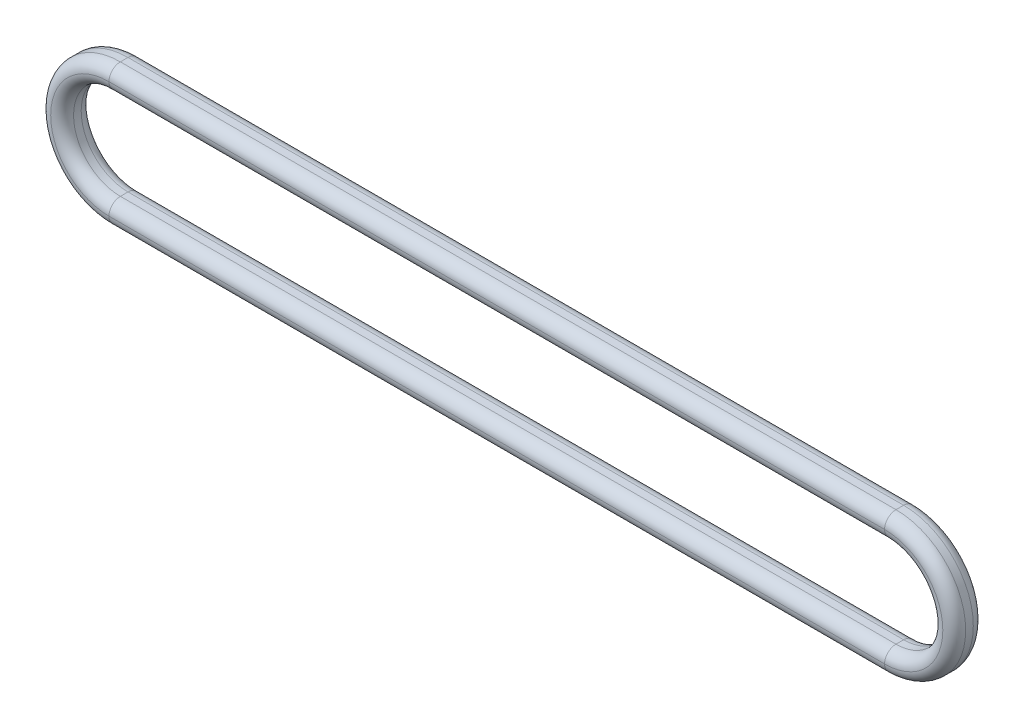
ISO-10303-21;
HEADER;
FILE_DESCRIPTION(('STEP AP214'),'2;1');
FILE_NAME('part.step','',(''),(''),'','','');
FILE_SCHEMA(('AUTOMOTIVE_DESIGN { 1 0 10303 214 1 1 1 1 }'));
ENDSEC;
DATA;
#1=APPLICATION_CONTEXT('core data for automotive mechanical design processes');
#2=APPLICATION_PROTOCOL_DEFINITION('international standard','automotive_design',2000,#1);
#3=PRODUCT_CONTEXT('',#1,'mechanical');
#4=PRODUCT('Part','Part','',(#3));
#5=PRODUCT_RELATED_PRODUCT_CATEGORY('part','',(#4));
#6=PRODUCT_DEFINITION_FORMATION('','',#4);
#7=PRODUCT_DEFINITION_CONTEXT('part definition',#1,'design');
#8=PRODUCT_DEFINITION('design','',#6,#7);
#9=PRODUCT_DEFINITION_SHAPE('','',#8);
#10=(LENGTH_UNIT() NAMED_UNIT(*) SI_UNIT(.MILLI.,.METRE.));
#11=(NAMED_UNIT(*) PLANE_ANGLE_UNIT() SI_UNIT($,.RADIAN.));
#12=(NAMED_UNIT(*) SI_UNIT($,.STERADIAN.) SOLID_ANGLE_UNIT());
#13=UNCERTAINTY_MEASURE_WITH_UNIT(LENGTH_MEASURE(1.E-05),#10,'distance_accuracy_value','');
#14=(GEOMETRIC_REPRESENTATION_CONTEXT(3) GLOBAL_UNCERTAINTY_ASSIGNED_CONTEXT((#13)) GLOBAL_UNIT_ASSIGNED_CONTEXT((#10,
#11,#12)) REPRESENTATION_CONTEXT('',''));
#15=CARTESIAN_POINT('',(0.,0.,0.));
#16=DIRECTION('',(0.,0.,1.));
#17=DIRECTION('',(1.,0.,0.));
#18=AXIS2_PLACEMENT_3D('',#15,#16,#17);
#19=CARTESIAN_POINT('',(-361.95,0.,14.224));
#20=DIRECTION('',(0.,0.,-1.));
#21=DIRECTION('',(-1.,0.,0.));
#22=AXIS2_PLACEMENT_3D('',#19,#20,#21);
#23=CYLINDRICAL_SURFACE('',#22,32.512);
#24=DIRECTION('',(0.,0.,-1.));
#25=VECTOR('',#24,1.);
#26=CARTESIAN_POINT('',(-361.95,32.512,14.224));
#27=LINE('',#26,#25);
#28=CARTESIAN_POINT('',(-361.95,32.512,8.89));
#29=VERTEX_POINT('',#28);
#30=CARTESIAN_POINT('',(-361.95,32.512,5.334));
#31=VERTEX_POINT('',#30);
#32=EDGE_CURVE('E166',#29,#31,#27,.T.);
#33=ORIENTED_EDGE('',*,*,#32,.T.);
#34=CARTESIAN_POINT('',(-361.95,0.,5.334));
#35=DIRECTION('',(0.,0.,1.));
#36=DIRECTION('',(1.,0.,0.));
#37=AXIS2_PLACEMENT_3D('',#34,#35,#36);
#38=CIRCLE('',#37,32.512);
#39=CARTESIAN_POINT('',(-361.95,-32.512,5.334));
#40=VERTEX_POINT('',#39);
#41=EDGE_CURVE('E11',#31,#40,#38,.T.);
#42=ORIENTED_EDGE('',*,*,#41,.T.);
#43=DIRECTION('',(0.,0.,-1.));
#44=VECTOR('',#43,1.);
#45=CARTESIAN_POINT('',(-361.95,-32.512,14.224));
#46=LINE('',#45,#44);
#47=CARTESIAN_POINT('',(-361.95,-32.512,8.89));
#48=VERTEX_POINT('',#47);
#49=EDGE_CURVE('E248',#48,#40,#46,.T.);
#50=ORIENTED_EDGE('',*,*,#49,.F.);
#51=CARTESIAN_POINT('',(-361.95,0.,8.89));
#52=DIRECTION('',(0.,0.,1.));
#53=DIRECTION('',(1.,0.,0.));
#54=AXIS2_PLACEMENT_3D('',#51,#52,#53);
#55=CIRCLE('',#54,32.512);
#56=EDGE_CURVE('E43',#48,#29,#55,.F.);
#57=ORIENTED_EDGE('',*,*,#56,.T.);
#58=EDGE_LOOP('',(#33,#42,#50,#57));
#59=FACE_BOUND('',#58,.T.);
#60=ADVANCED_FACE('F33',(#59),#23,.T.);
#61=CARTESIAN_POINT('',(-361.95,-32.512,14.224));
#62=DIRECTION('',(0.,1.,0.));
#63=DIRECTION('',(0.,0.,1.));
#64=AXIS2_PLACEMENT_3D('',#61,#62,#63);
#65=PLANE('',#64);
#66=ORIENTED_EDGE('',*,*,#49,.T.);
#67=DIRECTION('',(1.,0.,0.));
#68=VECTOR('',#67,1.);
#69=CARTESIAN_POINT('',(-361.95,-32.512,5.334));
#70=LINE('',#69,#68);
#71=CARTESIAN_POINT('',(0.,-32.512,5.334));
#72=VERTEX_POINT('',#71);
#73=EDGE_CURVE('E262',#40,#72,#70,.T.);
#74=ORIENTED_EDGE('',*,*,#73,.T.);
#75=DIRECTION('',(0.,0.,-1.));
#76=VECTOR('',#75,1.);
#77=CARTESIAN_POINT('',(0.,-32.512,14.224));
#78=LINE('',#77,#76);
#79=CARTESIAN_POINT('',(0.,-32.512,8.89));
#80=VERTEX_POINT('',#79);
#81=EDGE_CURVE('E159',#80,#72,#78,.T.);
#82=ORIENTED_EDGE('',*,*,#81,.F.);
#83=DIRECTION('',(1.,0.,0.));
#84=VECTOR('',#83,1.);
#85=CARTESIAN_POINT('',(-361.95,-32.512,8.89));
#86=LINE('',#85,#84);
#87=EDGE_CURVE('E136',#80,#48,#86,.F.);
#88=ORIENTED_EDGE('',*,*,#87,.T.);
#89=EDGE_LOOP('',(#66,#74,#82,#88));
#90=FACE_BOUND('',#89,.T.);
#91=ADVANCED_FACE('F314',(#90),#65,.F.);
#92=CARTESIAN_POINT('',(0.,0.,14.224));
#93=DIRECTION('',(0.,0.,-1.));
#94=DIRECTION('',(-1.,0.,0.));
#95=AXIS2_PLACEMENT_3D('',#92,#93,#94);
#96=CYLINDRICAL_SURFACE('',#95,32.512);
#97=ORIENTED_EDGE('',*,*,#81,.T.);
#98=CARTESIAN_POINT('',(0.,0.,5.334));
#99=DIRECTION('',(0.,0.,1.));
#100=DIRECTION('',(1.,0.,0.));
#101=AXIS2_PLACEMENT_3D('',#98,#99,#100);
#102=CIRCLE('',#101,32.512);
#103=CARTESIAN_POINT('',(0.,32.512,5.334));
#104=VERTEX_POINT('',#103);
#105=EDGE_CURVE('E156',#72,#104,#102,.T.);
#106=ORIENTED_EDGE('',*,*,#105,.T.);
#107=DIRECTION('',(0.,0.,-1.));
#108=VECTOR('',#107,1.);
#109=CARTESIAN_POINT('',(0.,32.512,14.224));
#110=LINE('',#109,#108);
#111=CARTESIAN_POINT('',(0.,32.512,8.89));
#112=VERTEX_POINT('',#111);
#113=EDGE_CURVE('E158',#112,#104,#110,.T.);
#114=ORIENTED_EDGE('',*,*,#113,.F.);
#115=CARTESIAN_POINT('',(0.,0.,8.89));
#116=DIRECTION('',(0.,0.,1.));
#117=DIRECTION('',(1.,0.,0.));
#118=AXIS2_PLACEMENT_3D('',#115,#116,#117);
#119=CIRCLE('',#118,32.512);
#120=EDGE_CURVE('E89',#112,#80,#119,.F.);
#121=ORIENTED_EDGE('',*,*,#120,.T.);
#122=EDGE_LOOP('',(#97,#106,#114,#121));
#123=FACE_BOUND('',#122,.T.);
#124=ADVANCED_FACE('F157',(#123),#96,.T.);
#125=CARTESIAN_POINT('',(-361.95,32.512,14.224));
#126=DIRECTION('',(0.,-1.,0.));
#127=DIRECTION('',(0.,0.,-1.));
#128=AXIS2_PLACEMENT_3D('',#125,#126,#127);
#129=PLANE('',#128);
#130=ORIENTED_EDGE('',*,*,#113,.T.);
#131=DIRECTION('',(-1.,0.,0.));
#132=VECTOR('',#131,1.);
#133=CARTESIAN_POINT('',(-361.95,32.512,5.334));
#134=LINE('',#133,#132);
#135=EDGE_CURVE('E52',#104,#31,#134,.T.);
#136=ORIENTED_EDGE('',*,*,#135,.T.);
#137=ORIENTED_EDGE('',*,*,#32,.F.);
#138=DIRECTION('',(-1.,0.,0.));
#139=VECTOR('',#138,1.);
#140=CARTESIAN_POINT('',(0.,32.512,8.89));
#141=LINE('',#140,#139);
#142=EDGE_CURVE('E163',#29,#112,#141,.F.);
#143=ORIENTED_EDGE('',*,*,#142,.T.);
#144=EDGE_LOOP('',(#130,#136,#137,#143));
#145=FACE_BOUND('',#144,.T.);
#146=ADVANCED_FACE('F165',(#145),#129,.F.);
#147=CARTESIAN_POINT('',(0.,0.,14.224));
#148=DIRECTION('',(0.,0.,-1.));
#149=DIRECTION('',(-1.,0.,0.));
#150=AXIS2_PLACEMENT_3D('',#147,#148,#149);
#151=CYLINDRICAL_SURFACE('',#150,21.844);
#152=DIRECTION('',(0.,0.,-1.));
#153=VECTOR('',#152,1.);
#154=CARTESIAN_POINT('',(0.,21.844,14.224));
#155=LINE('',#154,#153);
#156=CARTESIAN_POINT('',(0.,21.844,8.89));
#157=VERTEX_POINT('',#156);
#158=CARTESIAN_POINT('',(0.,21.844,5.334));
#159=VERTEX_POINT('',#158);
#160=EDGE_CURVE('E229',#157,#159,#155,.T.);
#161=ORIENTED_EDGE('',*,*,#160,.T.);
#162=CARTESIAN_POINT('',(0.,0.,5.334));
#163=DIRECTION('',(0.,0.,1.));
#164=DIRECTION('',(1.,0.,0.));
#165=AXIS2_PLACEMENT_3D('',#162,#163,#164);
#166=CIRCLE('',#165,21.844);
#167=CARTESIAN_POINT('',(0.,-21.844,5.334));
#168=VERTEX_POINT('',#167);
#169=EDGE_CURVE('E232',#159,#168,#166,.F.);
#170=ORIENTED_EDGE('',*,*,#169,.T.);
#171=DIRECTION('',(0.,0.,-1.));
#172=VECTOR('',#171,1.);
#173=CARTESIAN_POINT('',(0.,-21.844,14.224));
#174=LINE('',#173,#172);
#175=CARTESIAN_POINT('',(0.,-21.844,8.89));
#176=VERTEX_POINT('',#175);
#177=EDGE_CURVE('E184',#176,#168,#174,.T.);
#178=ORIENTED_EDGE('',*,*,#177,.F.);
#179=CARTESIAN_POINT('',(0.,0.,8.89));
#180=DIRECTION('',(0.,0.,1.));
#181=DIRECTION('',(1.,0.,0.));
#182=AXIS2_PLACEMENT_3D('',#179,#180,#181);
#183=CIRCLE('',#182,21.844);
#184=EDGE_CURVE('E226',#176,#157,#183,.T.);
#185=ORIENTED_EDGE('',*,*,#184,.T.);
#186=EDGE_LOOP('',(#161,#170,#178,#185));
#187=FACE_BOUND('',#186,.T.);
#188=ADVANCED_FACE('F228',(#187),#151,.F.);
#189=CARTESIAN_POINT('',(0.,21.844,14.224));
#190=DIRECTION('',(0.,-1.,0.));
#191=DIRECTION('',(1.,0.,0.));
#192=AXIS2_PLACEMENT_3D('',#189,#190,#191);
#193=PLANE('',#192);
#194=DIRECTION('',(0.,0.,-1.));
#195=VECTOR('',#194,1.);
#196=CARTESIAN_POINT('',(-361.95,21.844,14.224));
#197=LINE('',#196,#195);
#198=CARTESIAN_POINT('',(-361.95,21.844,8.89));
#199=VERTEX_POINT('',#198);
#200=CARTESIAN_POINT('',(-361.95,21.844,5.334));
#201=VERTEX_POINT('',#200);
#202=EDGE_CURVE('E240',#199,#201,#197,.T.);
#203=ORIENTED_EDGE('',*,*,#202,.T.);
#204=DIRECTION('',(-1.,0.,0.));
#205=VECTOR('',#204,1.);
#206=CARTESIAN_POINT('',(0.,21.844,5.334));
#207=LINE('',#206,#205);
#208=EDGE_CURVE('E233',#201,#159,#207,.F.);
#209=ORIENTED_EDGE('',*,*,#208,.T.);
#210=ORIENTED_EDGE('',*,*,#160,.F.);
#211=DIRECTION('',(-1.,0.,0.));
#212=VECTOR('',#211,1.);
#213=CARTESIAN_POINT('',(0.,21.844,8.89));
#214=LINE('',#213,#212);
#215=EDGE_CURVE('E119',#157,#199,#214,.T.);
#216=ORIENTED_EDGE('',*,*,#215,.T.);
#217=EDGE_LOOP('',(#203,#209,#210,#216));
#218=FACE_BOUND('',#217,.T.);
#219=ADVANCED_FACE('F237',(#218),#193,.T.);
#220=CARTESIAN_POINT('',(-361.95,0.,14.224));
#221=DIRECTION('',(0.,0.,-1.));
#222=DIRECTION('',(-1.,0.,0.));
#223=AXIS2_PLACEMENT_3D('',#220,#221,#222);
#224=CYLINDRICAL_SURFACE('',#223,21.844);
#225=DIRECTION('',(0.,0.,-1.));
#226=VECTOR('',#225,1.);
#227=CARTESIAN_POINT('',(-361.95,-21.844,14.224));
#228=LINE('',#227,#226);
#229=CARTESIAN_POINT('',(-361.95,-21.844,8.89));
#230=VERTEX_POINT('',#229);
#231=CARTESIAN_POINT('',(-361.95,-21.844,5.334));
#232=VERTEX_POINT('',#231);
#233=EDGE_CURVE('E243',#230,#232,#228,.T.);
#234=ORIENTED_EDGE('',*,*,#233,.T.);
#235=CARTESIAN_POINT('',(-361.95,0.,5.334));
#236=DIRECTION('',(0.,0.,1.));
#237=DIRECTION('',(1.,0.,0.));
#238=AXIS2_PLACEMENT_3D('',#235,#236,#237);
#239=CIRCLE('',#238,21.844);
#240=EDGE_CURVE('E256',#232,#201,#239,.F.);
#241=ORIENTED_EDGE('',*,*,#240,.T.);
#242=ORIENTED_EDGE('',*,*,#202,.F.);
#243=CARTESIAN_POINT('',(-361.95,0.,8.89));
#244=DIRECTION('',(0.,0.,1.));
#245=DIRECTION('',(1.,0.,0.));
#246=AXIS2_PLACEMENT_3D('',#243,#244,#245);
#247=CIRCLE('',#246,21.844);
#248=EDGE_CURVE('E209',#199,#230,#247,.T.);
#249=ORIENTED_EDGE('',*,*,#248,.T.);
#250=EDGE_LOOP('',(#234,#241,#242,#249));
#251=FACE_BOUND('',#250,.T.);
#252=ADVANCED_FACE('F398',(#251),#224,.F.);
#253=CARTESIAN_POINT('',(0.,-21.844,14.224));
#254=DIRECTION('',(0.,1.,0.));
#255=DIRECTION('',(-1.,0.,0.));
#256=AXIS2_PLACEMENT_3D('',#253,#254,#255);
#257=PLANE('',#256);
#258=ORIENTED_EDGE('',*,*,#177,.T.);
#259=DIRECTION('',(1.,0.,0.));
#260=VECTOR('',#259,1.);
#261=CARTESIAN_POINT('',(-361.95,-21.844,5.334));
#262=LINE('',#261,#260);
#263=EDGE_CURVE('E252',#168,#232,#262,.F.);
#264=ORIENTED_EDGE('',*,*,#263,.T.);
#265=ORIENTED_EDGE('',*,*,#233,.F.);
#266=DIRECTION('',(1.,0.,0.));
#267=VECTOR('',#266,1.);
#268=CARTESIAN_POINT('',(0.,-21.844,8.89));
#269=LINE('',#268,#267);
#270=EDGE_CURVE('E203',#230,#176,#269,.T.);
#271=ORIENTED_EDGE('',*,*,#270,.T.);
#272=EDGE_LOOP('',(#258,#264,#265,#271));
#273=FACE_BOUND('',#272,.T.);
#274=ADVANCED_FACE('F298',(#273),#257,.T.);
#275=CARTESIAN_POINT('',(-361.95,27.178,5.334));
#276=DIRECTION('',(-1.,0.,0.));
#277=DIRECTION('',(0.,0.,1.));
#278=AXIS2_PLACEMENT_3D('',#275,#276,#277);
#279=CYLINDRICAL_SURFACE('',#278,5.334);
#280=CARTESIAN_POINT('',(-361.95,27.178,5.334));
#281=DIRECTION('',(-1.,0.,0.));
#282=DIRECTION('',(0.,0.,1.));
#283=AXIS2_PLACEMENT_3D('',#280,#281,#282);
#284=CIRCLE('',#283,5.334);
#285=CARTESIAN_POINT('',(-361.95,27.178,0.));
#286=VERTEX_POINT('',#285);
#287=EDGE_CURVE('E174',#31,#286,#284,.T.);
#288=ORIENTED_EDGE('',*,*,#287,.F.);
#289=ORIENTED_EDGE('',*,*,#135,.F.);
#290=CARTESIAN_POINT('',(0.,27.178,5.334));
#291=DIRECTION('',(1.,0.,0.));
#292=DIRECTION('',(0.,0.,-1.));
#293=AXIS2_PLACEMENT_3D('',#290,#291,#292);
#294=CIRCLE('',#293,5.334);
#295=CARTESIAN_POINT('',(0.,27.178,0.));
#296=VERTEX_POINT('',#295);
#297=EDGE_CURVE('E172',#296,#104,#294,.T.);
#298=ORIENTED_EDGE('',*,*,#297,.F.);
#299=DIRECTION('',(-1.,0.,0.));
#300=VECTOR('',#299,1.);
#301=CARTESIAN_POINT('',(-361.95,27.178,0.));
#302=LINE('',#301,#300);
#303=EDGE_CURVE('E182',#286,#296,#302,.F.);
#304=ORIENTED_EDGE('',*,*,#303,.F.);
#305=EDGE_LOOP('',(#288,#289,#298,#304));
#306=FACE_BOUND('',#305,.T.);
#307=ADVANCED_FACE('F170',(#306),#279,.T.);
#308=CARTESIAN_POINT('',(-361.95,0.,5.334));
#309=DIRECTION('',(0.,0.,1.));
#310=DIRECTION('',(1.,0.,0.));
#311=AXIS2_PLACEMENT_3D('',#308,#309,#310);
#312=TOROIDAL_SURFACE('',#311,27.178,5.334);
#313=ORIENTED_EDGE('',*,*,#41,.F.);
#314=ORIENTED_EDGE('',*,*,#287,.T.);
#315=CARTESIAN_POINT('',(-361.95,0.,0.));
#316=DIRECTION('',(0.,0.,1.));
#317=DIRECTION('',(1.,0.,0.));
#318=AXIS2_PLACEMENT_3D('',#315,#316,#317);
#319=CIRCLE('',#318,27.178);
#320=CARTESIAN_POINT('',(-361.95,-27.178,0.));
#321=VERTEX_POINT('',#320);
#322=EDGE_CURVE('E282',#321,#286,#319,.F.);
#323=ORIENTED_EDGE('',*,*,#322,.F.);
#324=CARTESIAN_POINT('',(-361.95,-27.178,5.334));
#325=DIRECTION('',(1.,0.,0.));
#326=DIRECTION('',(0.,0.,-1.));
#327=AXIS2_PLACEMENT_3D('',#324,#325,#326);
#328=CIRCLE('',#327,5.334);
#329=EDGE_CURVE('E279',#40,#321,#328,.T.);
#330=ORIENTED_EDGE('',*,*,#329,.F.);
#331=EDGE_LOOP('',(#313,#314,#323,#330));
#332=FACE_BOUND('',#331,.T.);
#333=ADVANCED_FACE('F310',(#332),#312,.T.);
#334=CARTESIAN_POINT('',(0.,0.,5.334));
#335=DIRECTION('',(0.,0.,1.));
#336=DIRECTION('',(1.,0.,0.));
#337=AXIS2_PLACEMENT_3D('',#334,#335,#336);
#338=TOROIDAL_SURFACE('',#337,27.178,5.334);
#339=ORIENTED_EDGE('',*,*,#297,.T.);
#340=ORIENTED_EDGE('',*,*,#105,.F.);
#341=CARTESIAN_POINT('',(0.,-27.178,5.334));
#342=DIRECTION('',(-1.,0.,0.));
#343=DIRECTION('',(0.,0.,1.));
#344=AXIS2_PLACEMENT_3D('',#341,#342,#343);
#345=CIRCLE('',#344,5.334);
#346=CARTESIAN_POINT('',(0.,-27.178,0.));
#347=VERTEX_POINT('',#346);
#348=EDGE_CURVE('E277',#347,#72,#345,.T.);
#349=ORIENTED_EDGE('',*,*,#348,.F.);
#350=CARTESIAN_POINT('',(0.,0.,0.));
#351=DIRECTION('',(0.,0.,1.));
#352=DIRECTION('',(1.,0.,0.));
#353=AXIS2_PLACEMENT_3D('',#350,#351,#352);
#354=CIRCLE('',#353,27.178);
#355=EDGE_CURVE('E180',#296,#347,#354,.F.);
#356=ORIENTED_EDGE('',*,*,#355,.F.);
#357=EDGE_LOOP('',(#339,#340,#349,#356));
#358=FACE_BOUND('',#357,.T.);
#359=ADVANCED_FACE('F178',(#358),#338,.T.);
#360=CARTESIAN_POINT('',(-361.95,27.178,5.334));
#361=DIRECTION('',(1.,0.,0.));
#362=DIRECTION('',(0.,1.,0.));
#363=AXIS2_PLACEMENT_3D('',#360,#361,#362);
#364=CYLINDRICAL_SURFACE('',#363,5.334);
#365=CARTESIAN_POINT('',(0.,27.178,5.334));
#366=DIRECTION('',(1.,0.,0.));
#367=DIRECTION('',(0.,1.,0.));
#368=AXIS2_PLACEMENT_3D('',#365,#366,#367);
#369=CIRCLE('',#368,5.334);
#370=EDGE_CURVE('E274',#159,#296,#369,.T.);
#371=ORIENTED_EDGE('',*,*,#370,.F.);
#372=ORIENTED_EDGE('',*,*,#208,.F.);
#373=CARTESIAN_POINT('',(-361.95,27.178,5.334));
#374=DIRECTION('',(-1.,0.,0.));
#375=DIRECTION('',(0.,0.,1.));
#376=AXIS2_PLACEMENT_3D('',#373,#374,#375);
#377=CIRCLE('',#376,5.334);
#378=EDGE_CURVE('E186',#286,#201,#377,.T.);
#379=ORIENTED_EDGE('',*,*,#378,.F.);
#380=ORIENTED_EDGE('',*,*,#303,.T.);
#381=EDGE_LOOP('',(#371,#372,#379,#380));
#382=FACE_BOUND('',#381,.T.);
#383=ADVANCED_FACE('F291',(#382),#364,.T.);
#384=CARTESIAN_POINT('',(-361.95,0.,5.334));
#385=DIRECTION('',(0.,0.,1.));
#386=DIRECTION('',(1.,0.,0.));
#387=AXIS2_PLACEMENT_3D('',#384,#385,#386);
#388=TOROIDAL_SURFACE('',#387,27.178,5.334);
#389=ORIENTED_EDGE('',*,*,#378,.T.);
#390=ORIENTED_EDGE('',*,*,#240,.F.);
#391=CARTESIAN_POINT('',(-361.95,-27.178,5.334));
#392=DIRECTION('',(1.,0.,0.));
#393=DIRECTION('',(0.,0.,-1.));
#394=AXIS2_PLACEMENT_3D('',#391,#392,#393);
#395=CIRCLE('',#394,5.334);
#396=EDGE_CURVE('E272',#321,#232,#395,.T.);
#397=ORIENTED_EDGE('',*,*,#396,.F.);
#398=ORIENTED_EDGE('',*,*,#322,.T.);
#399=EDGE_LOOP('',(#389,#390,#397,#398));
#400=FACE_BOUND('',#399,.T.);
#401=ADVANCED_FACE('F288',(#400),#388,.T.);
#402=CARTESIAN_POINT('',(-361.95,-27.178,5.334));
#403=DIRECTION('',(1.,0.,0.));
#404=DIRECTION('',(0.,0.,-1.));
#405=AXIS2_PLACEMENT_3D('',#402,#403,#404);
#406=CYLINDRICAL_SURFACE('',#405,5.334);
#407=ORIENTED_EDGE('',*,*,#73,.F.);
#408=ORIENTED_EDGE('',*,*,#329,.T.);
#409=DIRECTION('',(1.,0.,0.));
#410=VECTOR('',#409,1.);
#411=CARTESIAN_POINT('',(-361.95,-27.178,0.));
#412=LINE('',#411,#410);
#413=EDGE_CURVE('E269',#347,#321,#412,.F.);
#414=ORIENTED_EDGE('',*,*,#413,.F.);
#415=ORIENTED_EDGE('',*,*,#348,.T.);
#416=EDGE_LOOP('',(#407,#408,#414,#415));
#417=FACE_BOUND('',#416,.T.);
#418=ADVANCED_FACE('F307',(#417),#406,.T.);
#419=CARTESIAN_POINT('',(0.,0.,5.334));
#420=DIRECTION('',(0.,0.,1.));
#421=DIRECTION('',(1.,0.,0.));
#422=AXIS2_PLACEMENT_3D('',#419,#420,#421);
#423=TOROIDAL_SURFACE('',#422,27.178,5.334);
#424=ORIENTED_EDGE('',*,*,#370,.T.);
#425=ORIENTED_EDGE('',*,*,#355,.T.);
#426=CARTESIAN_POINT('',(0.,-27.178,5.334));
#427=DIRECTION('',(-1.,0.,0.));
#428=DIRECTION('',(0.,-1.,0.));
#429=AXIS2_PLACEMENT_3D('',#426,#427,#428);
#430=CIRCLE('',#429,5.334);
#431=EDGE_CURVE('E94',#168,#347,#430,.T.);
#432=ORIENTED_EDGE('',*,*,#431,.F.);
#433=ORIENTED_EDGE('',*,*,#169,.F.);
#434=EDGE_LOOP('',(#424,#425,#432,#433));
#435=FACE_BOUND('',#434,.T.);
#436=ADVANCED_FACE('F295',(#435),#423,.T.);
#437=CARTESIAN_POINT('',(-361.95,-27.178,5.334));
#438=DIRECTION('',(-1.,0.,0.));
#439=DIRECTION('',(0.,-1.,0.));
#440=AXIS2_PLACEMENT_3D('',#437,#438,#439);
#441=CYLINDRICAL_SURFACE('',#440,5.334);
#442=ORIENTED_EDGE('',*,*,#396,.T.);
#443=ORIENTED_EDGE('',*,*,#263,.F.);
#444=ORIENTED_EDGE('',*,*,#431,.T.);
#445=ORIENTED_EDGE('',*,*,#413,.T.);
#446=EDGE_LOOP('',(#442,#443,#444,#445));
#447=FACE_BOUND('',#446,.T.);
#448=ADVANCED_FACE('F303',(#447),#441,.T.);
#449=CARTESIAN_POINT('',(0.,0.,8.89));
#450=DIRECTION('',(0.,0.,1.));
#451=DIRECTION('',(1.,0.,0.));
#452=AXIS2_PLACEMENT_3D('',#449,#450,#451);
#453=TOROIDAL_SURFACE('',#452,27.178,5.334);
#454=CARTESIAN_POINT('',(0.,-27.178,8.89));
#455=DIRECTION('',(-1.,0.,0.));
#456=DIRECTION('',(0.,-1.,0.));
#457=AXIS2_PLACEMENT_3D('',#454,#455,#456);
#458=CIRCLE('',#457,5.334);
#459=CARTESIAN_POINT('',(0.,-27.178,14.224));
#460=VERTEX_POINT('',#459);
#461=EDGE_CURVE('E107',#80,#460,#458,.T.);
#462=ORIENTED_EDGE('',*,*,#461,.F.);
#463=ORIENTED_EDGE('',*,*,#120,.F.);
#464=CARTESIAN_POINT('',(0.,27.178,8.89));
#465=DIRECTION('',(-1.,0.,0.));
#466=DIRECTION('',(0.,0.,1.));
#467=AXIS2_PLACEMENT_3D('',#464,#465,#466);
#468=CIRCLE('',#467,5.334);
#469=CARTESIAN_POINT('',(0.,27.178,14.224));
#470=VERTEX_POINT('',#469);
#471=EDGE_CURVE('E37',#470,#112,#468,.T.);
#472=ORIENTED_EDGE('',*,*,#471,.F.);
#473=CARTESIAN_POINT('',(0.,0.,14.224));
#474=DIRECTION('',(0.,0.,1.));
#475=DIRECTION('',(1.,0.,0.));
#476=AXIS2_PLACEMENT_3D('',#473,#474,#475);
#477=CIRCLE('',#476,27.178);
#478=EDGE_CURVE('E83',#460,#470,#477,.T.);
#479=ORIENTED_EDGE('',*,*,#478,.F.);
#480=EDGE_LOOP('',(#462,#463,#472,#479));
#481=FACE_BOUND('',#480,.T.);
#482=ADVANCED_FACE('F35',(#481),#453,.T.);
#483=CARTESIAN_POINT('',(-361.95,27.178,8.89));
#484=DIRECTION('',(1.,0.,0.));
#485=DIRECTION('',(0.,0.,-1.));
#486=AXIS2_PLACEMENT_3D('',#483,#484,#485);
#487=CYLINDRICAL_SURFACE('',#486,5.334);
#488=ORIENTED_EDGE('',*,*,#471,.T.);
#489=ORIENTED_EDGE('',*,*,#142,.F.);
#490=CARTESIAN_POINT('',(-361.95,27.178,8.89));
#491=DIRECTION('',(-1.,0.,0.));
#492=DIRECTION('',(0.,0.,1.));
#493=AXIS2_PLACEMENT_3D('',#490,#491,#492);
#494=CIRCLE('',#493,5.334);
#495=CARTESIAN_POINT('',(-361.95,27.178,14.224));
#496=VERTEX_POINT('',#495);
#497=EDGE_CURVE('E112',#496,#29,#494,.T.);
#498=ORIENTED_EDGE('',*,*,#497,.F.);
#499=DIRECTION('',(-1.,0.,0.));
#500=VECTOR('',#499,1.);
#501=CARTESIAN_POINT('',(-361.95,27.178,14.224));
#502=LINE('',#501,#500);
#503=EDGE_CURVE('E109',#470,#496,#502,.T.);
#504=ORIENTED_EDGE('',*,*,#503,.F.);
#505=EDGE_LOOP('',(#488,#489,#498,#504));
#506=FACE_BOUND('',#505,.T.);
#507=ADVANCED_FACE('F110',(#506),#487,.T.);
#508=CARTESIAN_POINT('',(0.,0.,8.89));
#509=DIRECTION('',(0.,0.,1.));
#510=DIRECTION('',(1.,0.,0.));
#511=AXIS2_PLACEMENT_3D('',#508,#509,#510);
#512=TOROIDAL_SURFACE('',#511,27.178,5.334);
#513=CARTESIAN_POINT('',(0.,-27.178,8.89));
#514=DIRECTION('',(-1.,0.,0.));
#515=DIRECTION('',(0.,-1.,0.));
#516=AXIS2_PLACEMENT_3D('',#513,#514,#515);
#517=CIRCLE('',#516,5.334);
#518=EDGE_CURVE('E105',#460,#176,#517,.T.);
#519=ORIENTED_EDGE('',*,*,#518,.F.);
#520=ORIENTED_EDGE('',*,*,#478,.T.);
#521=CARTESIAN_POINT('',(0.,27.178,8.89));
#522=DIRECTION('',(-1.,0.,0.));
#523=DIRECTION('',(0.,-1.,0.));
#524=AXIS2_PLACEMENT_3D('',#521,#522,#523);
#525=CIRCLE('',#524,5.334);
#526=EDGE_CURVE('E102',#157,#470,#525,.T.);
#527=ORIENTED_EDGE('',*,*,#526,.F.);
#528=ORIENTED_EDGE('',*,*,#184,.F.);
#529=EDGE_LOOP('',(#519,#520,#527,#528));
#530=FACE_BOUND('',#529,.T.);
#531=ADVANCED_FACE('F98',(#530),#512,.T.);
#532=CARTESIAN_POINT('',(-361.95,-27.178,8.89));
#533=DIRECTION('',(-1.,0.,0.));
#534=DIRECTION('',(0.,0.,1.));
#535=AXIS2_PLACEMENT_3D('',#532,#533,#534);
#536=CYLINDRICAL_SURFACE('',#535,5.334);
#537=CARTESIAN_POINT('',(-361.95,-27.178,8.89));
#538=DIRECTION('',(-1.,0.,0.));
#539=DIRECTION('',(0.,0.,1.));
#540=AXIS2_PLACEMENT_3D('',#537,#538,#539);
#541=CIRCLE('',#540,5.334);
#542=CARTESIAN_POINT('',(-361.95,-27.178,14.224));
#543=VERTEX_POINT('',#542);
#544=EDGE_CURVE('E126',#48,#543,#541,.T.);
#545=ORIENTED_EDGE('',*,*,#544,.F.);
#546=ORIENTED_EDGE('',*,*,#87,.F.);
#547=ORIENTED_EDGE('',*,*,#461,.T.);
#548=DIRECTION('',(1.,0.,0.));
#549=VECTOR('',#548,1.);
#550=CARTESIAN_POINT('',(0.,-27.178,14.224));
#551=LINE('',#550,#549);
#552=EDGE_CURVE('E121',#543,#460,#551,.T.);
#553=ORIENTED_EDGE('',*,*,#552,.F.);
#554=EDGE_LOOP('',(#545,#546,#547,#553));
#555=FACE_BOUND('',#554,.T.);
#556=ADVANCED_FACE('F132',(#555),#536,.T.);
#557=CARTESIAN_POINT('',(-361.95,0.,8.89));
#558=DIRECTION('',(0.,0.,1.));
#559=DIRECTION('',(1.,0.,0.));
#560=AXIS2_PLACEMENT_3D('',#557,#558,#559);
#561=TOROIDAL_SURFACE('',#560,27.178,5.334);
#562=ORIENTED_EDGE('',*,*,#56,.F.);
#563=ORIENTED_EDGE('',*,*,#544,.T.);
#564=CARTESIAN_POINT('',(-361.95,0.,14.224));
#565=DIRECTION('',(0.,0.,1.));
#566=DIRECTION('',(1.,0.,0.));
#567=AXIS2_PLACEMENT_3D('',#564,#565,#566);
#568=CIRCLE('',#567,27.178);
#569=EDGE_CURVE('E196',#496,#543,#568,.T.);
#570=ORIENTED_EDGE('',*,*,#569,.F.);
#571=ORIENTED_EDGE('',*,*,#497,.T.);
#572=EDGE_LOOP('',(#562,#563,#570,#571));
#573=FACE_BOUND('',#572,.T.);
#574=ADVANCED_FACE('F347',(#573),#561,.T.);
#575=CARTESIAN_POINT('',(0.,27.178,8.89));
#576=DIRECTION('',(-1.,0.,0.));
#577=DIRECTION('',(0.,-1.,0.));
#578=AXIS2_PLACEMENT_3D('',#575,#576,#577);
#579=CYLINDRICAL_SURFACE('',#578,5.334);
#580=ORIENTED_EDGE('',*,*,#526,.T.);
#581=ORIENTED_EDGE('',*,*,#503,.T.);
#582=CARTESIAN_POINT('',(-361.95,27.178,8.89));
#583=DIRECTION('',(-1.,0.,0.));
#584=DIRECTION('',(0.,0.,1.));
#585=AXIS2_PLACEMENT_3D('',#582,#583,#584);
#586=CIRCLE('',#585,5.334);
#587=EDGE_CURVE('E193',#199,#496,#586,.T.);
#588=ORIENTED_EDGE('',*,*,#587,.F.);
#589=ORIENTED_EDGE('',*,*,#215,.F.);
#590=EDGE_LOOP('',(#580,#581,#588,#589));
#591=FACE_BOUND('',#590,.T.);
#592=ADVANCED_FACE('F117',(#591),#579,.T.);
#593=CARTESIAN_POINT('',(0.,-27.178,8.89));
#594=DIRECTION('',(1.,0.,0.));
#595=DIRECTION('',(0.,1.,0.));
#596=AXIS2_PLACEMENT_3D('',#593,#594,#595);
#597=CYLINDRICAL_SURFACE('',#596,5.334);
#598=ORIENTED_EDGE('',*,*,#518,.T.);
#599=ORIENTED_EDGE('',*,*,#270,.F.);
#600=CARTESIAN_POINT('',(-361.95,-27.178,8.89));
#601=DIRECTION('',(-1.,0.,0.));
#602=DIRECTION('',(0.,0.,1.));
#603=AXIS2_PLACEMENT_3D('',#600,#601,#602);
#604=CIRCLE('',#603,5.334);
#605=EDGE_CURVE('E190',#543,#230,#604,.T.);
#606=ORIENTED_EDGE('',*,*,#605,.F.);
#607=ORIENTED_EDGE('',*,*,#552,.T.);
#608=EDGE_LOOP('',(#598,#599,#606,#607));
#609=FACE_BOUND('',#608,.T.);
#610=ADVANCED_FACE('F199',(#609),#597,.T.);
#611=CARTESIAN_POINT('',(-361.95,0.,8.89));
#612=DIRECTION('',(0.,0.,1.));
#613=DIRECTION('',(1.,0.,0.));
#614=AXIS2_PLACEMENT_3D('',#611,#612,#613);
#615=TOROIDAL_SURFACE('',#614,27.178,5.334);
#616=ORIENTED_EDGE('',*,*,#587,.T.);
#617=ORIENTED_EDGE('',*,*,#569,.T.);
#618=ORIENTED_EDGE('',*,*,#605,.T.);
#619=ORIENTED_EDGE('',*,*,#248,.F.);
#620=EDGE_LOOP('',(#616,#617,#618,#619));
#621=FACE_BOUND('',#620,.T.);
#622=ADVANCED_FACE('F207',(#621),#615,.T.);
#623=CLOSED_SHELL('',(#60,#91,#124,#146,#188,#219,#252,#274,#307,#333,#359,#383,#401,#418,#436,
#448,#482,#507,#531,#556,#574,#592,#610,#622));
#624=MANIFOLD_SOLID_BREP('B2',#623);
#625=ADVANCED_BREP_SHAPE_REPRESENTATION('',(#18,#624),#14);
#626=SHAPE_DEFINITION_REPRESENTATION(#9,#625);
ENDSEC;
END-ISO-10303-21;
